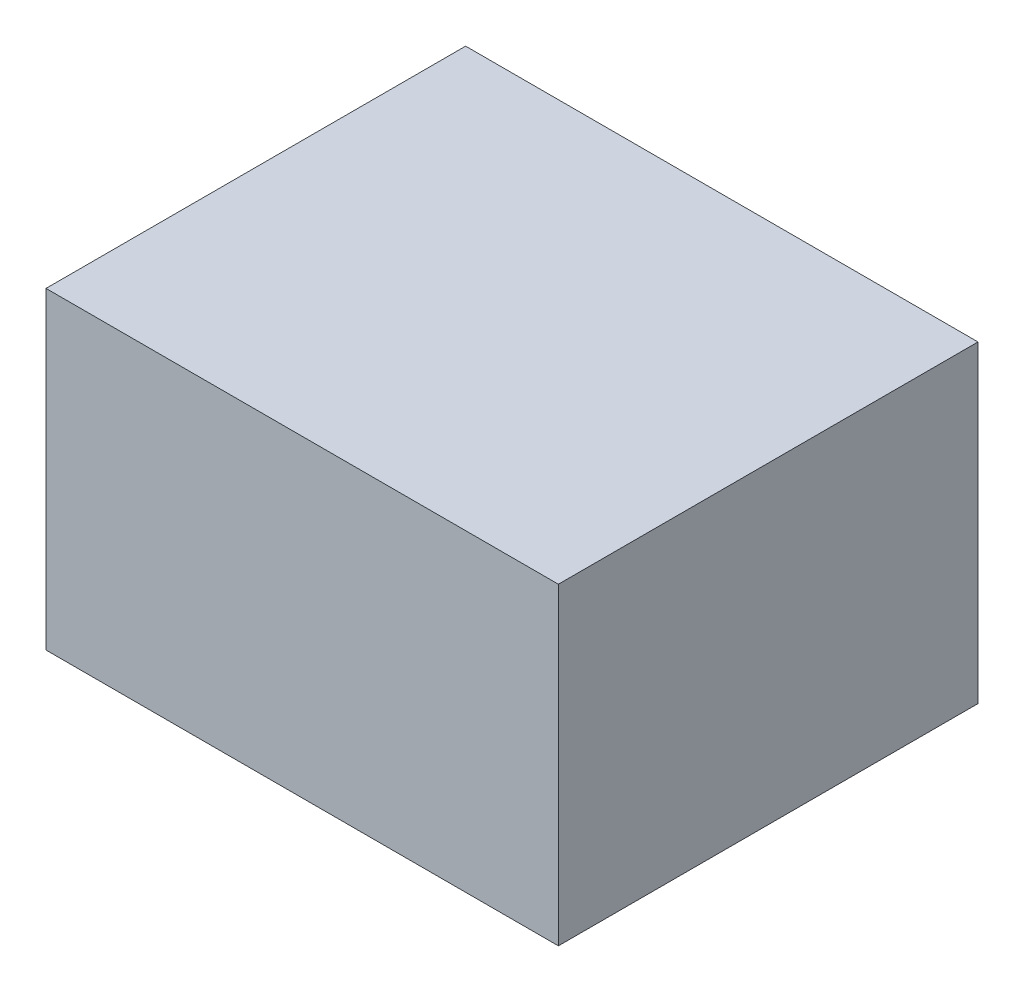
ISO-10303-21;
HEADER;
FILE_DESCRIPTION(('STEP AP214'),'2;1');
FILE_NAME('part.step','',(''),(''),'','','');
FILE_SCHEMA(('AUTOMOTIVE_DESIGN { 1 0 10303 214 1 1 1 1 }'));
ENDSEC;
DATA;
#1=APPLICATION_CONTEXT('core data for automotive mechanical design processes');
#2=APPLICATION_PROTOCOL_DEFINITION('international standard','automotive_design',2000,#1);
#3=PRODUCT_CONTEXT('',#1,'mechanical');
#4=PRODUCT('Part','Part','',(#3));
#5=PRODUCT_RELATED_PRODUCT_CATEGORY('part','',(#4));
#6=PRODUCT_DEFINITION_FORMATION('','',#4);
#7=PRODUCT_DEFINITION_CONTEXT('part definition',#1,'design');
#8=PRODUCT_DEFINITION('design','',#6,#7);
#9=PRODUCT_DEFINITION_SHAPE('','',#8);
#10=(LENGTH_UNIT() NAMED_UNIT(*) SI_UNIT(.MILLI.,.METRE.));
#11=(NAMED_UNIT(*) PLANE_ANGLE_UNIT() SI_UNIT($,.RADIAN.));
#12=(NAMED_UNIT(*) SI_UNIT($,.STERADIAN.) SOLID_ANGLE_UNIT());
#13=UNCERTAINTY_MEASURE_WITH_UNIT(LENGTH_MEASURE(1.E-05),#10,'distance_accuracy_value','');
#14=(GEOMETRIC_REPRESENTATION_CONTEXT(3) GLOBAL_UNCERTAINTY_ASSIGNED_CONTEXT((#13)) GLOBAL_UNIT_ASSIGNED_CONTEXT((#10,
#11,#12)) REPRESENTATION_CONTEXT('',''));
#15=CARTESIAN_POINT('',(0.,0.,0.));
#16=DIRECTION('',(0.,0.,1.));
#17=DIRECTION('',(1.,0.,0.));
#18=AXIS2_PLACEMENT_3D('',#15,#16,#17);
#19=CARTESIAN_POINT('',(6.38000000000001,3.9,10.45));
#20=DIRECTION('',(-1.,0.,0.));
#21=DIRECTION('',(0.,0.,1.));
#22=AXIS2_PLACEMENT_3D('',#19,#20,#21);
#23=PLANE('',#22);
#24=DIRECTION('',(0.,1.,0.));
#25=VECTOR('',#24,1.);
#26=CARTESIAN_POINT('',(6.38000000000001,3.9,0.));
#27=LINE('',#26,#25);
#28=CARTESIAN_POINT('',(6.38000000000001,-3.9,0.));
#29=VERTEX_POINT('',#28);
#30=CARTESIAN_POINT('',(6.38000000000001,3.9,0.));
#31=VERTEX_POINT('',#30);
#32=EDGE_CURVE('E96',#29,#31,#27,.T.);
#33=ORIENTED_EDGE('',*,*,#32,.T.);
#34=DIRECTION('',(0.,0.,-1.));
#35=VECTOR('',#34,1.);
#36=CARTESIAN_POINT('',(6.38000000000001,3.9,10.45));
#37=LINE('',#36,#35);
#38=CARTESIAN_POINT('',(6.38000000000001,3.9,10.45));
#39=VERTEX_POINT('',#38);
#40=EDGE_CURVE('E11',#39,#31,#37,.T.);
#41=ORIENTED_EDGE('',*,*,#40,.F.);
#42=DIRECTION('',(0.,1.,0.));
#43=VECTOR('',#42,1.);
#44=CARTESIAN_POINT('',(6.38000000000001,3.9,10.45));
#45=LINE('',#44,#43);
#46=CARTESIAN_POINT('',(6.38000000000001,-3.9,10.45));
#47=VERTEX_POINT('',#46);
#48=EDGE_CURVE('E84',#47,#39,#45,.T.);
#49=ORIENTED_EDGE('',*,*,#48,.F.);
#50=DIRECTION('',(0.,0.,-1.));
#51=VECTOR('',#50,1.);
#52=CARTESIAN_POINT('',(6.38000000000001,-3.9,10.45));
#53=LINE('',#52,#51);
#54=EDGE_CURVE('E92',#47,#29,#53,.T.);
#55=ORIENTED_EDGE('',*,*,#54,.T.);
#56=EDGE_LOOP('',(#33,#41,#49,#55));
#57=FACE_BOUND('',#56,.T.);
#58=ADVANCED_FACE('F33',(#57),#23,.F.);
#59=CARTESIAN_POINT('',(6.38000000000001,3.9,10.45));
#60=DIRECTION('',(0.,-1.,0.));
#61=DIRECTION('',(0.,0.,-1.));
#62=AXIS2_PLACEMENT_3D('',#59,#60,#61);
#63=PLANE('',#62);
#64=DIRECTION('',(-1.,0.,0.));
#65=VECTOR('',#64,1.);
#66=CARTESIAN_POINT('',(6.38000000000001,3.9,0.));
#67=LINE('',#66,#65);
#68=CARTESIAN_POINT('',(-6.38,3.9,0.));
#69=VERTEX_POINT('',#68);
#70=EDGE_CURVE('E88',#31,#69,#67,.T.);
#71=ORIENTED_EDGE('',*,*,#70,.T.);
#72=DIRECTION('',(0.,0.,-1.));
#73=VECTOR('',#72,1.);
#74=CARTESIAN_POINT('',(-6.38,3.9,10.45));
#75=LINE('',#74,#73);
#76=CARTESIAN_POINT('',(-6.38,3.9,10.45));
#77=VERTEX_POINT('',#76);
#78=EDGE_CURVE('E41',#77,#69,#75,.T.);
#79=ORIENTED_EDGE('',*,*,#78,.F.);
#80=DIRECTION('',(-1.,0.,0.));
#81=VECTOR('',#80,1.);
#82=CARTESIAN_POINT('',(6.38000000000001,3.9,10.45));
#83=LINE('',#82,#81);
#84=EDGE_CURVE('E79',#39,#77,#83,.T.);
#85=ORIENTED_EDGE('',*,*,#84,.F.);
#86=ORIENTED_EDGE('',*,*,#40,.T.);
#87=EDGE_LOOP('',(#71,#79,#85,#86));
#88=FACE_BOUND('',#87,.T.);
#89=ADVANCED_FACE('F87',(#88),#63,.F.);
#90=CARTESIAN_POINT('',(-6.38,3.9,10.45));
#91=DIRECTION('',(1.,0.,0.));
#92=DIRECTION('',(0.,0.,-1.));
#93=AXIS2_PLACEMENT_3D('',#90,#91,#92);
#94=PLANE('',#93);
#95=DIRECTION('',(0.,-1.,0.));
#96=VECTOR('',#95,1.);
#97=CARTESIAN_POINT('',(-6.38,3.9,0.));
#98=LINE('',#97,#96);
#99=CARTESIAN_POINT('',(-6.38,-3.9,0.));
#100=VERTEX_POINT('',#99);
#101=EDGE_CURVE('E66',#69,#100,#98,.T.);
#102=ORIENTED_EDGE('',*,*,#101,.T.);
#103=DIRECTION('',(0.,0.,-1.));
#104=VECTOR('',#103,1.);
#105=CARTESIAN_POINT('',(-6.38,-3.9,10.45));
#106=LINE('',#105,#104);
#107=CARTESIAN_POINT('',(-6.38,-3.9,10.45));
#108=VERTEX_POINT('',#107);
#109=EDGE_CURVE('E89',#108,#100,#106,.T.);
#110=ORIENTED_EDGE('',*,*,#109,.F.);
#111=DIRECTION('',(0.,-1.,0.));
#112=VECTOR('',#111,1.);
#113=CARTESIAN_POINT('',(-6.38,3.9,10.45));
#114=LINE('',#113,#112);
#115=EDGE_CURVE('E82',#77,#108,#114,.T.);
#116=ORIENTED_EDGE('',*,*,#115,.F.);
#117=ORIENTED_EDGE('',*,*,#78,.T.);
#118=EDGE_LOOP('',(#102,#110,#116,#117));
#119=FACE_BOUND('',#118,.T.);
#120=ADVANCED_FACE('F90',(#119),#94,.F.);
#121=CARTESIAN_POINT('',(6.38000000000001,-3.9,10.45));
#122=DIRECTION('',(0.,1.,0.));
#123=DIRECTION('',(0.,0.,1.));
#124=AXIS2_PLACEMENT_3D('',#121,#122,#123);
#125=PLANE('',#124);
#126=DIRECTION('',(1.,0.,0.));
#127=VECTOR('',#126,1.);
#128=CARTESIAN_POINT('',(6.38000000000001,-3.9,0.));
#129=LINE('',#128,#127);
#130=EDGE_CURVE('E72',#100,#29,#129,.T.);
#131=ORIENTED_EDGE('',*,*,#130,.T.);
#132=ORIENTED_EDGE('',*,*,#54,.F.);
#133=DIRECTION('',(1.,0.,0.));
#134=VECTOR('',#133,1.);
#135=CARTESIAN_POINT('',(6.38000000000001,-3.9,10.45));
#136=LINE('',#135,#134);
#137=EDGE_CURVE('E49',#108,#47,#136,.T.);
#138=ORIENTED_EDGE('',*,*,#137,.F.);
#139=ORIENTED_EDGE('',*,*,#109,.T.);
#140=EDGE_LOOP('',(#131,#132,#138,#139));
#141=FACE_BOUND('',#140,.T.);
#142=ADVANCED_FACE('F103',(#141),#125,.F.);
#143=CARTESIAN_POINT('',(0.,0.,10.45));
#144=DIRECTION('',(0.,0.,-1.));
#145=DIRECTION('',(-1.,0.,0.));
#146=AXIS2_PLACEMENT_3D('',#143,#144,#145);
#147=PLANE('',#146);
#148=ORIENTED_EDGE('',*,*,#48,.T.);
#149=ORIENTED_EDGE('',*,*,#84,.T.);
#150=ORIENTED_EDGE('',*,*,#115,.T.);
#151=ORIENTED_EDGE('',*,*,#137,.T.);
#152=EDGE_LOOP('',(#148,#149,#150,#151));
#153=FACE_BOUND('',#152,.T.);
#154=ADVANCED_FACE('F80',(#153),#147,.F.);
#155=CARTESIAN_POINT('',(0.,0.,0.));
#156=DIRECTION('',(0.,0.,-1.));
#157=DIRECTION('',(-1.,0.,0.));
#158=AXIS2_PLACEMENT_3D('',#155,#156,#157);
#159=PLANE('',#158);
#160=ORIENTED_EDGE('',*,*,#32,.F.);
#161=ORIENTED_EDGE('',*,*,#130,.F.);
#162=ORIENTED_EDGE('',*,*,#101,.F.);
#163=ORIENTED_EDGE('',*,*,#70,.F.);
#164=EDGE_LOOP('',(#160,#161,#162,#163));
#165=FACE_BOUND('',#164,.T.);
#166=ADVANCED_FACE('F106',(#165),#159,.T.);
#167=CLOSED_SHELL('',(#58,#89,#120,#142,#154,#166));
#168=MANIFOLD_SOLID_BREP('B2',#167);
#169=ADVANCED_BREP_SHAPE_REPRESENTATION('',(#18,#168),#14);
#170=SHAPE_DEFINITION_REPRESENTATION(#9,#169);
ENDSEC;
END-ISO-10303-21;
